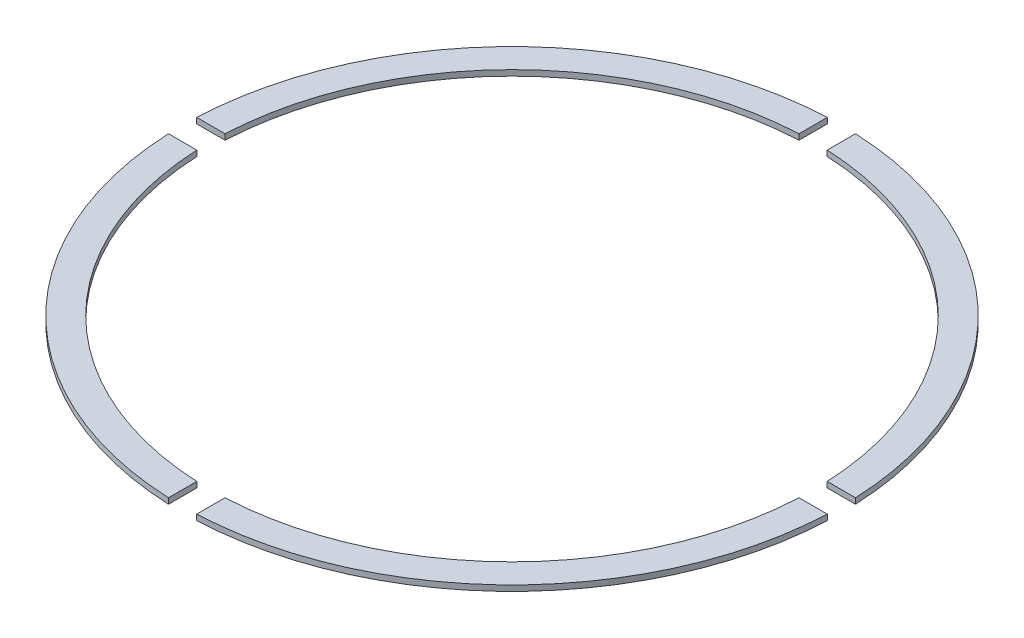
ISO-10303-21;
HEADER;
FILE_DESCRIPTION(('STEP AP214'),'2;1');
FILE_NAME('part.step','',(''),(''),'','','');
FILE_SCHEMA(('AUTOMOTIVE_DESIGN { 1 0 10303 214 1 1 1 1 }'));
ENDSEC;
DATA;
#1=APPLICATION_CONTEXT('core data for automotive mechanical design processes');
#2=APPLICATION_PROTOCOL_DEFINITION('international standard','automotive_design',2000,#1);
#3=PRODUCT_CONTEXT('',#1,'mechanical');
#4=PRODUCT('Part','Part','',(#3));
#5=PRODUCT_RELATED_PRODUCT_CATEGORY('part','',(#4));
#6=PRODUCT_DEFINITION_FORMATION('','',#4);
#7=PRODUCT_DEFINITION_CONTEXT('part definition',#1,'design');
#8=PRODUCT_DEFINITION('design','',#6,#7);
#9=PRODUCT_DEFINITION_SHAPE('','',#8);
#10=(LENGTH_UNIT() NAMED_UNIT(*) SI_UNIT(.MILLI.,.METRE.));
#11=(NAMED_UNIT(*) PLANE_ANGLE_UNIT() SI_UNIT($,.RADIAN.));
#12=(NAMED_UNIT(*) SI_UNIT($,.STERADIAN.) SOLID_ANGLE_UNIT());
#13=UNCERTAINTY_MEASURE_WITH_UNIT(LENGTH_MEASURE(1.E-05),#10,'distance_accuracy_value','');
#14=(GEOMETRIC_REPRESENTATION_CONTEXT(3) GLOBAL_UNCERTAINTY_ASSIGNED_CONTEXT((#13)) GLOBAL_UNIT_ASSIGNED_CONTEXT((#10,
#11,#12)) REPRESENTATION_CONTEXT('',''));
#15=CARTESIAN_POINT('',(0.,0.,0.));
#16=DIRECTION('',(0.,0.,1.));
#17=DIRECTION('',(1.,0.,0.));
#18=AXIS2_PLACEMENT_3D('',#15,#16,#17);
#19=CARTESIAN_POINT('',(0.,1.5,0.));
#20=DIRECTION('',(0.,1.,0.));
#21=DIRECTION('',(0.,0.,1.));
#22=AXIS2_PLACEMENT_3D('',#19,#20,#21);
#23=PLANE('',#22);
#24=DIRECTION('',(0.,0.,-1.));
#25=VECTOR('',#24,1.);
#26=CARTESIAN_POINT('',(7.49999999999936,1.5,183.804563233899));
#27=LINE('',#26,#25);
#28=CARTESIAN_POINT('',(7.49999999999939,1.5,174.839211849059));
#29=VERTEX_POINT('',#28);
#30=CARTESIAN_POINT('',(7.49999999999944,1.5,159.824122084246));
#31=VERTEX_POINT('',#30);
#32=EDGE_CURVE('E52',#29,#31,#27,.T.);
#33=ORIENTED_EDGE('',*,*,#32,.F.);
#34=CARTESIAN_POINT('',(0.,1.5,0.));
#35=DIRECTION('',(0.,1.,0.));
#36=DIRECTION('',(0.,0.,1.));
#37=AXIS2_PLACEMENT_3D('',#34,#35,#36);
#38=CIRCLE('',#37,175.);
#39=CARTESIAN_POINT('',(174.839211849059,1.5,7.5));
#40=VERTEX_POINT('',#39);
#41=EDGE_CURVE('E104',#29,#40,#38,.T.);
#42=ORIENTED_EDGE('',*,*,#41,.T.);
#43=DIRECTION('',(1.,0.,0.));
#44=VECTOR('',#43,1.);
#45=CARTESIAN_POINT('',(183.804563233898,1.5,7.5));
#46=LINE('',#45,#44);
#47=CARTESIAN_POINT('',(159.824122084246,1.5,7.5));
#48=VERTEX_POINT('',#47);
#49=EDGE_CURVE('E85',#48,#40,#46,.T.);
#50=ORIENTED_EDGE('',*,*,#49,.F.);
#51=CARTESIAN_POINT('',(0.,1.5,0.));
#52=DIRECTION('',(0.,1.,0.));
#53=DIRECTION('',(0.,0.,1.));
#54=AXIS2_PLACEMENT_3D('',#51,#52,#53);
#55=CIRCLE('',#54,160.);
#56=EDGE_CURVE('E91',#31,#48,#55,.T.);
#57=ORIENTED_EDGE('',*,*,#56,.F.);
#58=EDGE_LOOP('',(#33,#42,#50,#57));
#59=FACE_BOUND('',#58,.T.);
#60=ADVANCED_FACE('F44',(#59),#23,.T.);
#61=CARTESIAN_POINT('',(0.,-1.5,0.));
#62=DIRECTION('',(0.,1.,0.));
#63=DIRECTION('',(0.,0.,1.));
#64=AXIS2_PLACEMENT_3D('',#61,#62,#63);
#65=PLANE('',#64);
#66=CARTESIAN_POINT('',(0.,-1.5,0.));
#67=DIRECTION('',(0.,1.,0.));
#68=DIRECTION('',(0.,0.,1.));
#69=AXIS2_PLACEMENT_3D('',#66,#67,#68);
#70=CIRCLE('',#69,175.);
#71=CARTESIAN_POINT('',(7.49999999999939,-1.5,174.839211849059));
#72=VERTEX_POINT('',#71);
#73=CARTESIAN_POINT('',(174.839211849059,-1.5,7.5));
#74=VERTEX_POINT('',#73);
#75=EDGE_CURVE('E47',#72,#74,#70,.T.);
#76=ORIENTED_EDGE('',*,*,#75,.F.);
#77=DIRECTION('',(0.,0.,-1.));
#78=VECTOR('',#77,1.);
#79=CARTESIAN_POINT('',(7.49999999999936,-1.5,183.804563233899));
#80=LINE('',#79,#78);
#81=CARTESIAN_POINT('',(7.49999999999944,-1.5,159.824122084246));
#82=VERTEX_POINT('',#81);
#83=EDGE_CURVE('E64',#72,#82,#80,.T.);
#84=ORIENTED_EDGE('',*,*,#83,.T.);
#85=CARTESIAN_POINT('',(0.,-1.5,0.));
#86=DIRECTION('',(0.,1.,0.));
#87=DIRECTION('',(0.,0.,1.));
#88=AXIS2_PLACEMENT_3D('',#85,#86,#87);
#89=CIRCLE('',#88,160.);
#90=CARTESIAN_POINT('',(159.824122084246,-1.5,7.5));
#91=VERTEX_POINT('',#90);
#92=EDGE_CURVE('E93',#82,#91,#89,.T.);
#93=ORIENTED_EDGE('',*,*,#92,.T.);
#94=DIRECTION('',(1.,0.,0.));
#95=VECTOR('',#94,1.);
#96=CARTESIAN_POINT('',(183.804563233898,-1.5,7.5));
#97=LINE('',#96,#95);
#98=EDGE_CURVE('E103',#91,#74,#97,.T.);
#99=ORIENTED_EDGE('',*,*,#98,.T.);
#100=EDGE_LOOP('',(#76,#84,#93,#99));
#101=FACE_BOUND('',#100,.T.);
#102=ADVANCED_FACE('F113',(#101),#65,.F.);
#103=CARTESIAN_POINT('',(0.,1.5,0.));
#104=DIRECTION('',(0.,-1.,0.));
#105=DIRECTION('',(0.,0.,-1.));
#106=AXIS2_PLACEMENT_3D('',#103,#104,#105);
#107=CYLINDRICAL_SURFACE('',#106,175.);
#108=ORIENTED_EDGE('',*,*,#41,.F.);
#109=DIRECTION('',(0.,-1.,0.));
#110=VECTOR('',#109,1.);
#111=CARTESIAN_POINT('',(7.49999999999939,1.5,174.839211849059));
#112=LINE('',#111,#110);
#113=EDGE_CURVE('E60',#29,#72,#112,.T.);
#114=ORIENTED_EDGE('',*,*,#113,.T.);
#115=ORIENTED_EDGE('',*,*,#75,.T.);
#116=DIRECTION('',(0.,-1.,0.));
#117=VECTOR('',#116,1.);
#118=CARTESIAN_POINT('',(174.839211849059,1.5,7.5));
#119=LINE('',#118,#117);
#120=EDGE_CURVE('E97',#74,#40,#119,.F.);
#121=ORIENTED_EDGE('',*,*,#120,.T.);
#122=EDGE_LOOP('',(#108,#114,#115,#121));
#123=FACE_BOUND('',#122,.T.);
#124=ADVANCED_FACE('F118',(#123),#107,.T.);
#125=CARTESIAN_POINT('',(0.,1.5,0.));
#126=DIRECTION('',(0.,-1.,0.));
#127=DIRECTION('',(0.,0.,-1.));
#128=AXIS2_PLACEMENT_3D('',#125,#126,#127);
#129=CYLINDRICAL_SURFACE('',#128,160.);
#130=DIRECTION('',(0.,-1.,0.));
#131=VECTOR('',#130,1.);
#132=CARTESIAN_POINT('',(7.49999999999944,1.5,159.824122084246));
#133=LINE('',#132,#131);
#134=EDGE_CURVE('E13',#31,#82,#133,.T.);
#135=ORIENTED_EDGE('',*,*,#134,.F.);
#136=ORIENTED_EDGE('',*,*,#56,.T.);
#137=DIRECTION('',(0.,-1.,0.));
#138=VECTOR('',#137,1.);
#139=CARTESIAN_POINT('',(159.824122084246,1.5,7.5));
#140=LINE('',#139,#138);
#141=EDGE_CURVE('E96',#91,#48,#140,.F.);
#142=ORIENTED_EDGE('',*,*,#141,.F.);
#143=ORIENTED_EDGE('',*,*,#92,.F.);
#144=EDGE_LOOP('',(#135,#136,#142,#143));
#145=FACE_BOUND('',#144,.T.);
#146=ADVANCED_FACE('F89',(#145),#129,.F.);
#147=CARTESIAN_POINT('',(183.804563233898,-1.5,7.5));
#148=DIRECTION('',(0.,0.,1.));
#149=DIRECTION('',(1.,0.,0.));
#150=AXIS2_PLACEMENT_3D('',#147,#148,#149);
#151=PLANE('',#150);
#152=ORIENTED_EDGE('',*,*,#98,.F.);
#153=ORIENTED_EDGE('',*,*,#141,.T.);
#154=ORIENTED_EDGE('',*,*,#49,.T.);
#155=ORIENTED_EDGE('',*,*,#120,.F.);
#156=EDGE_LOOP('',(#152,#153,#154,#155));
#157=FACE_BOUND('',#156,.T.);
#158=ADVANCED_FACE('F116',(#157),#151,.F.);
#159=CARTESIAN_POINT('',(7.49999999999936,-1.5,183.804563233899));
#160=DIRECTION('',(1.,0.,0.));
#161=DIRECTION('',(0.,0.,-1.));
#162=AXIS2_PLACEMENT_3D('',#159,#160,#161);
#163=PLANE('',#162);
#164=ORIENTED_EDGE('',*,*,#32,.T.);
#165=ORIENTED_EDGE('',*,*,#134,.T.);
#166=ORIENTED_EDGE('',*,*,#83,.F.);
#167=ORIENTED_EDGE('',*,*,#113,.F.);
#168=EDGE_LOOP('',(#164,#165,#166,#167));
#169=FACE_BOUND('',#168,.T.);
#170=ADVANCED_FACE('F81',(#169),#163,.F.);
#171=CLOSED_SHELL('',(#60,#102,#124,#146,#158,#170));
#172=MANIFOLD_SOLID_BREP('B2',#171);
#173=CARTESIAN_POINT('',(183.804563233898,-1.5,-7.5));
#174=DIRECTION('',(0.,0.,-1.));
#175=DIRECTION('',(-1.,0.,0.));
#176=AXIS2_PLACEMENT_3D('',#173,#174,#175);
#177=PLANE('',#176);
#178=DIRECTION('',(-1.,0.,0.));
#179=VECTOR('',#178,1.);
#180=CARTESIAN_POINT('',(183.804563233898,1.5,-7.5));
#181=LINE('',#180,#179);
#182=CARTESIAN_POINT('',(174.839211849059,1.5,-7.5));
#183=VERTEX_POINT('',#182);
#184=CARTESIAN_POINT('',(159.824122084246,1.5,-7.5));
#185=VERTEX_POINT('',#184);
#186=EDGE_CURVE('E241',#183,#185,#181,.T.);
#187=ORIENTED_EDGE('',*,*,#186,.T.);
#188=DIRECTION('',(0.,-1.,0.));
#189=VECTOR('',#188,1.);
#190=CARTESIAN_POINT('',(159.824122084246,1.5,-7.5));
#191=LINE('',#190,#189);
#192=CARTESIAN_POINT('',(159.824122084246,-1.5,-7.5));
#193=VERTEX_POINT('',#192);
#194=EDGE_CURVE('E230',#185,#193,#191,.T.);
#195=ORIENTED_EDGE('',*,*,#194,.T.);
#196=DIRECTION('',(-1.,0.,0.));
#197=VECTOR('',#196,1.);
#198=CARTESIAN_POINT('',(183.804563233898,-1.5,-7.5));
#199=LINE('',#198,#197);
#200=CARTESIAN_POINT('',(174.839211849059,-1.5,-7.5));
#201=VERTEX_POINT('',#200);
#202=EDGE_CURVE('E237',#201,#193,#199,.T.);
#203=ORIENTED_EDGE('',*,*,#202,.F.);
#204=DIRECTION('',(0.,-1.,0.));
#205=VECTOR('',#204,1.);
#206=CARTESIAN_POINT('',(174.839211849059,1.5,-7.5));
#207=LINE('',#206,#205);
#208=EDGE_CURVE('E232',#183,#201,#207,.T.);
#209=ORIENTED_EDGE('',*,*,#208,.F.);
#210=EDGE_LOOP('',(#187,#195,#203,#209));
#211=FACE_BOUND('',#210,.T.);
#212=ADVANCED_FACE('F177',(#211),#177,.F.);
#213=CARTESIAN_POINT('',(0.,1.5,0.));
#214=DIRECTION('',(0.,-1.,0.));
#215=DIRECTION('',(0.,0.,-1.));
#216=AXIS2_PLACEMENT_3D('',#213,#214,#215);
#217=CYLINDRICAL_SURFACE('',#216,175.);
#218=CARTESIAN_POINT('',(0.,-1.5,0.));
#219=DIRECTION('',(0.,1.,0.));
#220=DIRECTION('',(0.,0.,1.));
#221=AXIS2_PLACEMENT_3D('',#218,#219,#220);
#222=CIRCLE('',#221,175.);
#223=CARTESIAN_POINT('',(7.50000000000183,-1.5,-174.839211849059));
#224=VERTEX_POINT('',#223);
#225=EDGE_CURVE('E181',#201,#224,#222,.T.);
#226=ORIENTED_EDGE('',*,*,#225,.T.);
#227=DIRECTION('',(0.,-1.,0.));
#228=VECTOR('',#227,1.);
#229=CARTESIAN_POINT('',(7.50000000000183,1.5,-174.839211849059));
#230=LINE('',#229,#228);
#231=CARTESIAN_POINT('',(7.50000000000183,1.5,-174.839211849059));
#232=VERTEX_POINT('',#231);
#233=EDGE_CURVE('E195',#224,#232,#230,.F.);
#234=ORIENTED_EDGE('',*,*,#233,.T.);
#235=CARTESIAN_POINT('',(0.,1.5,0.));
#236=DIRECTION('',(0.,1.,0.));
#237=DIRECTION('',(0.,0.,1.));
#238=AXIS2_PLACEMENT_3D('',#235,#236,#237);
#239=CIRCLE('',#238,175.);
#240=EDGE_CURVE('E220',#183,#232,#239,.T.);
#241=ORIENTED_EDGE('',*,*,#240,.F.);
#242=ORIENTED_EDGE('',*,*,#208,.T.);
#243=EDGE_LOOP('',(#226,#234,#241,#242));
#244=FACE_BOUND('',#243,.T.);
#245=ADVANCED_FACE('F249',(#244),#217,.T.);
#246=CARTESIAN_POINT('',(0.,1.5,0.));
#247=DIRECTION('',(0.,-1.,0.));
#248=DIRECTION('',(0.,0.,-1.));
#249=AXIS2_PLACEMENT_3D('',#246,#247,#248);
#250=CYLINDRICAL_SURFACE('',#249,160.);
#251=DIRECTION('',(0.,-1.,0.));
#252=VECTOR('',#251,1.);
#253=CARTESIAN_POINT('',(7.50000000000168,1.5,-159.824122084246));
#254=LINE('',#253,#252);
#255=CARTESIAN_POINT('',(7.50000000000168,-1.5,-159.824122084246));
#256=VERTEX_POINT('',#255);
#257=CARTESIAN_POINT('',(7.50000000000168,1.5,-159.824122084246));
#258=VERTEX_POINT('',#257);
#259=EDGE_CURVE('E187',#256,#258,#254,.F.);
#260=ORIENTED_EDGE('',*,*,#259,.F.);
#261=CARTESIAN_POINT('',(0.,-1.5,0.));
#262=DIRECTION('',(0.,1.,0.));
#263=DIRECTION('',(0.,0.,1.));
#264=AXIS2_PLACEMENT_3D('',#261,#262,#263);
#265=CIRCLE('',#264,160.);
#266=EDGE_CURVE('E231',#193,#256,#265,.T.);
#267=ORIENTED_EDGE('',*,*,#266,.F.);
#268=ORIENTED_EDGE('',*,*,#194,.F.);
#269=CARTESIAN_POINT('',(0.,1.5,0.));
#270=DIRECTION('',(0.,1.,0.));
#271=DIRECTION('',(0.,0.,1.));
#272=AXIS2_PLACEMENT_3D('',#269,#270,#271);
#273=CIRCLE('',#272,160.);
#274=EDGE_CURVE('E226',#185,#258,#273,.T.);
#275=ORIENTED_EDGE('',*,*,#274,.T.);
#276=EDGE_LOOP('',(#260,#267,#268,#275));
#277=FACE_BOUND('',#276,.T.);
#278=ADVANCED_FACE('F229',(#277),#250,.F.);
#279=CARTESIAN_POINT('',(0.,-1.5,0.));
#280=DIRECTION('',(0.,1.,0.));
#281=DIRECTION('',(0.,0.,1.));
#282=AXIS2_PLACEMENT_3D('',#279,#280,#281);
#283=PLANE('',#282);
#284=ORIENTED_EDGE('',*,*,#266,.T.);
#285=DIRECTION('',(0.,0.,-1.));
#286=VECTOR('',#285,1.);
#287=CARTESIAN_POINT('',(7.50000000000192,-1.5,-183.804563233898));
#288=LINE('',#287,#286);
#289=EDGE_CURVE('E212',#256,#224,#288,.T.);
#290=ORIENTED_EDGE('',*,*,#289,.T.);
#291=ORIENTED_EDGE('',*,*,#225,.F.);
#292=ORIENTED_EDGE('',*,*,#202,.T.);
#293=EDGE_LOOP('',(#284,#290,#291,#292));
#294=FACE_BOUND('',#293,.T.);
#295=ADVANCED_FACE('F251',(#294),#283,.F.);
#296=CARTESIAN_POINT('',(0.,1.5,0.));
#297=DIRECTION('',(0.,1.,0.));
#298=DIRECTION('',(0.,0.,1.));
#299=AXIS2_PLACEMENT_3D('',#296,#297,#298);
#300=PLANE('',#299);
#301=DIRECTION('',(0.,0.,-1.));
#302=VECTOR('',#301,1.);
#303=CARTESIAN_POINT('',(7.50000000000192,1.5,-183.804563233898));
#304=LINE('',#303,#302);
#305=EDGE_CURVE('E42',#258,#232,#304,.T.);
#306=ORIENTED_EDGE('',*,*,#305,.F.);
#307=ORIENTED_EDGE('',*,*,#274,.F.);
#308=ORIENTED_EDGE('',*,*,#186,.F.);
#309=ORIENTED_EDGE('',*,*,#240,.T.);
#310=EDGE_LOOP('',(#306,#307,#308,#309));
#311=FACE_BOUND('',#310,.T.);
#312=ADVANCED_FACE('F179',(#311),#300,.T.);
#313=CARTESIAN_POINT('',(7.50000000000192,-1.5,-183.804563233898));
#314=DIRECTION('',(1.,0.,0.));
#315=DIRECTION('',(0.,0.,-1.));
#316=AXIS2_PLACEMENT_3D('',#313,#314,#315);
#317=PLANE('',#316);
#318=ORIENTED_EDGE('',*,*,#289,.F.);
#319=ORIENTED_EDGE('',*,*,#259,.T.);
#320=ORIENTED_EDGE('',*,*,#305,.T.);
#321=ORIENTED_EDGE('',*,*,#233,.F.);
#322=EDGE_LOOP('',(#318,#319,#320,#321));
#323=FACE_BOUND('',#322,.T.);
#324=ADVANCED_FACE('F215',(#323),#317,.F.);
#325=CLOSED_SHELL('',(#212,#245,#278,#295,#312,#324));
#326=MANIFOLD_SOLID_BREP('B7',#325);
#327=CARTESIAN_POINT('',(0.,1.5,0.));
#328=DIRECTION('',(0.,-1.,0.));
#329=DIRECTION('',(0.,0.,-1.));
#330=AXIS2_PLACEMENT_3D('',#327,#328,#329);
#331=CYLINDRICAL_SURFACE('',#330,175.);
#332=CARTESIAN_POINT('',(0.,-1.5,0.));
#333=DIRECTION('',(0.,1.,0.));
#334=DIRECTION('',(0.,0.,1.));
#335=AXIS2_PLACEMENT_3D('',#332,#333,#334);
#336=CIRCLE('',#335,175.);
#337=CARTESIAN_POINT('',(-7.49999999999817,-1.5,-174.839211849059));
#338=VERTEX_POINT('',#337);
#339=CARTESIAN_POINT('',(-174.839211849059,-1.5,-7.5));
#340=VERTEX_POINT('',#339);
#341=EDGE_CURVE('E313',#338,#340,#336,.T.);
#342=ORIENTED_EDGE('',*,*,#341,.T.);
#343=DIRECTION('',(0.,-1.,0.));
#344=VECTOR('',#343,1.);
#345=CARTESIAN_POINT('',(-174.839211849059,1.5,-7.5));
#346=LINE('',#345,#344);
#347=CARTESIAN_POINT('',(-174.839211849059,1.5,-7.5));
#348=VERTEX_POINT('',#347);
#349=EDGE_CURVE('E327',#340,#348,#346,.F.);
#350=ORIENTED_EDGE('',*,*,#349,.T.);
#351=CARTESIAN_POINT('',(0.,1.5,0.));
#352=DIRECTION('',(0.,1.,0.));
#353=DIRECTION('',(0.,0.,1.));
#354=AXIS2_PLACEMENT_3D('',#351,#352,#353);
#355=CIRCLE('',#354,175.);
#356=CARTESIAN_POINT('',(-7.49999999999817,1.5,-174.839211849059));
#357=VERTEX_POINT('',#356);
#358=EDGE_CURVE('E372',#357,#348,#355,.T.);
#359=ORIENTED_EDGE('',*,*,#358,.F.);
#360=DIRECTION('',(0.,-1.,0.));
#361=VECTOR('',#360,1.);
#362=CARTESIAN_POINT('',(-7.49999999999817,1.5,-174.839211849059));
#363=LINE('',#362,#361);
#364=EDGE_CURVE('E348',#357,#338,#363,.T.);
#365=ORIENTED_EDGE('',*,*,#364,.T.);
#366=EDGE_LOOP('',(#342,#350,#359,#365));
#367=FACE_BOUND('',#366,.T.);
#368=ADVANCED_FACE('F309',(#367),#331,.T.);
#369=CARTESIAN_POINT('',(0.,1.5,0.));
#370=DIRECTION('',(0.,-1.,0.));
#371=DIRECTION('',(0.,0.,-1.));
#372=AXIS2_PLACEMENT_3D('',#369,#370,#371);
#373=CYLINDRICAL_SURFACE('',#372,160.);
#374=DIRECTION('',(0.,-1.,0.));
#375=VECTOR('',#374,1.);
#376=CARTESIAN_POINT('',(-159.824122084246,1.5,-7.5));
#377=LINE('',#376,#375);
#378=CARTESIAN_POINT('',(-159.824122084246,-1.5,-7.5));
#379=VERTEX_POINT('',#378);
#380=CARTESIAN_POINT('',(-159.824122084246,1.5,-7.5));
#381=VERTEX_POINT('',#380);
#382=EDGE_CURVE('E319',#379,#381,#377,.F.);
#383=ORIENTED_EDGE('',*,*,#382,.F.);
#384=CARTESIAN_POINT('',(0.,-1.5,0.));
#385=DIRECTION('',(0.,1.,0.));
#386=DIRECTION('',(0.,0.,1.));
#387=AXIS2_PLACEMENT_3D('',#384,#385,#386);
#388=CIRCLE('',#387,160.);
#389=CARTESIAN_POINT('',(-7.49999999999832,-1.5,-159.824122084246));
#390=VERTEX_POINT('',#389);
#391=EDGE_CURVE('E358',#390,#379,#388,.T.);
#392=ORIENTED_EDGE('',*,*,#391,.F.);
#393=DIRECTION('',(0.,-1.,0.));
#394=VECTOR('',#393,1.);
#395=CARTESIAN_POINT('',(-7.49999999999832,1.5,-159.824122084246));
#396=LINE('',#395,#394);
#397=CARTESIAN_POINT('',(-7.49999999999832,1.5,-159.824122084246));
#398=VERTEX_POINT('',#397);
#399=EDGE_CURVE('E367',#398,#390,#396,.T.);
#400=ORIENTED_EDGE('',*,*,#399,.F.);
#401=CARTESIAN_POINT('',(0.,1.5,0.));
#402=DIRECTION('',(0.,1.,0.));
#403=DIRECTION('',(0.,0.,1.));
#404=AXIS2_PLACEMENT_3D('',#401,#402,#403);
#405=CIRCLE('',#404,160.);
#406=EDGE_CURVE('E366',#398,#381,#405,.T.);
#407=ORIENTED_EDGE('',*,*,#406,.T.);
#408=EDGE_LOOP('',(#383,#392,#400,#407));
#409=FACE_BOUND('',#408,.T.);
#410=ADVANCED_FACE('F363',(#409),#373,.F.);
#411=CARTESIAN_POINT('',(0.,-1.5,0.));
#412=DIRECTION('',(0.,1.,0.));
#413=DIRECTION('',(0.,0.,1.));
#414=AXIS2_PLACEMENT_3D('',#411,#412,#413);
#415=PLANE('',#414);
#416=ORIENTED_EDGE('',*,*,#391,.T.);
#417=DIRECTION('',(-1.,0.,0.));
#418=VECTOR('',#417,1.);
#419=CARTESIAN_POINT('',(-183.804563233898,-1.5,-7.5));
#420=LINE('',#419,#418);
#421=EDGE_CURVE('E350',#379,#340,#420,.T.);
#422=ORIENTED_EDGE('',*,*,#421,.T.);
#423=ORIENTED_EDGE('',*,*,#341,.F.);
#424=DIRECTION('',(0.,0.,1.));
#425=VECTOR('',#424,1.);
#426=CARTESIAN_POINT('',(-7.49999999999808,-1.5,-183.804563233899));
#427=LINE('',#426,#425);
#428=EDGE_CURVE('E345',#338,#390,#427,.T.);
#429=ORIENTED_EDGE('',*,*,#428,.T.);
#430=EDGE_LOOP('',(#416,#422,#423,#429));
#431=FACE_BOUND('',#430,.T.);
#432=ADVANCED_FACE('F369',(#431),#415,.F.);
#433=CARTESIAN_POINT('',(0.,1.5,0.));
#434=DIRECTION('',(0.,1.,0.));
#435=DIRECTION('',(0.,0.,1.));
#436=AXIS2_PLACEMENT_3D('',#433,#434,#435);
#437=PLANE('',#436);
#438=DIRECTION('',(-1.,0.,0.));
#439=VECTOR('',#438,1.);
#440=CARTESIAN_POINT('',(-183.804563233898,1.5,-7.5));
#441=LINE('',#440,#439);
#442=EDGE_CURVE('E175',#381,#348,#441,.T.);
#443=ORIENTED_EDGE('',*,*,#442,.F.);
#444=ORIENTED_EDGE('',*,*,#406,.F.);
#445=DIRECTION('',(0.,0.,1.));
#446=VECTOR('',#445,1.);
#447=CARTESIAN_POINT('',(-7.49999999999808,1.5,-183.804563233899));
#448=LINE('',#447,#446);
#449=EDGE_CURVE('E374',#357,#398,#448,.T.);
#450=ORIENTED_EDGE('',*,*,#449,.F.);
#451=ORIENTED_EDGE('',*,*,#358,.T.);
#452=EDGE_LOOP('',(#443,#444,#450,#451));
#453=FACE_BOUND('',#452,.T.);
#454=ADVANCED_FACE('F311',(#453),#437,.T.);
#455=CARTESIAN_POINT('',(-7.49999999999808,-1.5,-183.804563233899));
#456=DIRECTION('',(-1.,0.,0.));
#457=DIRECTION('',(0.,0.,1.));
#458=AXIS2_PLACEMENT_3D('',#455,#456,#457);
#459=PLANE('',#458);
#460=ORIENTED_EDGE('',*,*,#449,.T.);
#461=ORIENTED_EDGE('',*,*,#399,.T.);
#462=ORIENTED_EDGE('',*,*,#428,.F.);
#463=ORIENTED_EDGE('',*,*,#364,.F.);
#464=EDGE_LOOP('',(#460,#461,#462,#463));
#465=FACE_BOUND('',#464,.T.);
#466=ADVANCED_FACE('F380',(#465),#459,.F.);
#467=CARTESIAN_POINT('',(-183.804563233898,-1.5,-7.5));
#468=DIRECTION('',(0.,0.,-1.));
#469=DIRECTION('',(-1.,0.,0.));
#470=AXIS2_PLACEMENT_3D('',#467,#468,#469);
#471=PLANE('',#470);
#472=ORIENTED_EDGE('',*,*,#421,.F.);
#473=ORIENTED_EDGE('',*,*,#382,.T.);
#474=ORIENTED_EDGE('',*,*,#442,.T.);
#475=ORIENTED_EDGE('',*,*,#349,.F.);
#476=EDGE_LOOP('',(#472,#473,#474,#475));
#477=FACE_BOUND('',#476,.T.);
#478=ADVANCED_FACE('F352',(#477),#471,.F.);
#479=CLOSED_SHELL('',(#368,#410,#432,#454,#466,#478));
#480=MANIFOLD_SOLID_BREP('B36',#479);
#481=CARTESIAN_POINT('',(0.,1.5,0.));
#482=DIRECTION('',(0.,-1.,0.));
#483=DIRECTION('',(0.,0.,-1.));
#484=AXIS2_PLACEMENT_3D('',#481,#482,#483);
#485=CYLINDRICAL_SURFACE('',#484,175.);
#486=CARTESIAN_POINT('',(0.,-1.5,0.));
#487=DIRECTION('',(0.,1.,0.));
#488=DIRECTION('',(0.,0.,1.));
#489=AXIS2_PLACEMENT_3D('',#486,#487,#488);
#490=CIRCLE('',#489,175.);
#491=CARTESIAN_POINT('',(-174.839211849059,-1.5,7.5));
#492=VERTEX_POINT('',#491);
#493=CARTESIAN_POINT('',(-7.50000000000061,-1.5,174.839211849059));
#494=VERTEX_POINT('',#493);
#495=EDGE_CURVE('E490',#492,#494,#490,.T.);
#496=ORIENTED_EDGE('',*,*,#495,.T.);
#497=DIRECTION('',(0.,-1.,0.));
#498=VECTOR('',#497,1.);
#499=CARTESIAN_POINT('',(-7.50000000000061,1.5,174.839211849059));
#500=LINE('',#499,#498);
#501=CARTESIAN_POINT('',(-7.50000000000061,1.5,174.839211849059));
#502=VERTEX_POINT('',#501);
#503=EDGE_CURVE('E478',#494,#502,#500,.F.);
#504=ORIENTED_EDGE('',*,*,#503,.T.);
#505=CARTESIAN_POINT('',(0.,1.5,0.));
#506=DIRECTION('',(0.,1.,0.));
#507=DIRECTION('',(0.,0.,1.));
#508=AXIS2_PLACEMENT_3D('',#505,#506,#507);
#509=CIRCLE('',#508,175.);
#510=CARTESIAN_POINT('',(-174.839211849059,1.5,7.5));
#511=VERTEX_POINT('',#510);
#512=EDGE_CURVE('E485',#511,#502,#509,.T.);
#513=ORIENTED_EDGE('',*,*,#512,.F.);
#514=DIRECTION('',(0.,-1.,0.));
#515=VECTOR('',#514,1.);
#516=CARTESIAN_POINT('',(-174.839211849059,1.5,7.5));
#517=LINE('',#516,#515);
#518=EDGE_CURVE('E470',#511,#492,#517,.T.);
#519=ORIENTED_EDGE('',*,*,#518,.T.);
#520=EDGE_LOOP('',(#496,#504,#513,#519));
#521=FACE_BOUND('',#520,.T.);
#522=ADVANCED_FACE('F433',(#521),#485,.T.);
#523=CARTESIAN_POINT('',(0.,1.5,0.));
#524=DIRECTION('',(0.,-1.,0.));
#525=DIRECTION('',(0.,0.,-1.));
#526=AXIS2_PLACEMENT_3D('',#523,#524,#525);
#527=CYLINDRICAL_SURFACE('',#526,160.);
#528=DIRECTION('',(0.,-1.,0.));
#529=VECTOR('',#528,1.);
#530=CARTESIAN_POINT('',(-7.50000000000056,1.5,159.824122084246));
#531=LINE('',#530,#529);
#532=CARTESIAN_POINT('',(-7.50000000000056,-1.5,159.824122084246));
#533=VERTEX_POINT('',#532);
#534=CARTESIAN_POINT('',(-7.50000000000056,1.5,159.824122084246));
#535=VERTEX_POINT('',#534);
#536=EDGE_CURVE('E307',#533,#535,#531,.F.);
#537=ORIENTED_EDGE('',*,*,#536,.F.);
#538=CARTESIAN_POINT('',(0.,-1.5,0.));
#539=DIRECTION('',(0.,1.,0.));
#540=DIRECTION('',(0.,0.,1.));
#541=AXIS2_PLACEMENT_3D('',#538,#539,#540);
#542=CIRCLE('',#541,160.);
#543=CARTESIAN_POINT('',(-159.824122084246,-1.5,7.5));
#544=VERTEX_POINT('',#543);
#545=EDGE_CURVE('E494',#544,#533,#542,.T.);
#546=ORIENTED_EDGE('',*,*,#545,.F.);
#547=DIRECTION('',(0.,-1.,0.));
#548=VECTOR('',#547,1.);
#549=CARTESIAN_POINT('',(-159.824122084246,1.5,7.5));
#550=LINE('',#549,#548);
#551=CARTESIAN_POINT('',(-159.824122084246,1.5,7.5));
#552=VERTEX_POINT('',#551);
#553=EDGE_CURVE('E440',#552,#544,#550,.T.);
#554=ORIENTED_EDGE('',*,*,#553,.F.);
#555=CARTESIAN_POINT('',(0.,1.5,0.));
#556=DIRECTION('',(0.,1.,0.));
#557=DIRECTION('',(0.,0.,1.));
#558=AXIS2_PLACEMENT_3D('',#555,#556,#557);
#559=CIRCLE('',#558,160.);
#560=EDGE_CURVE('E487',#552,#535,#559,.T.);
#561=ORIENTED_EDGE('',*,*,#560,.T.);
#562=EDGE_LOOP('',(#537,#546,#554,#561));
#563=FACE_BOUND('',#562,.T.);
#564=ADVANCED_FACE('F504',(#563),#527,.F.);
#565=CARTESIAN_POINT('',(0.,-1.5,0.));
#566=DIRECTION('',(0.,1.,0.));
#567=DIRECTION('',(0.,0.,1.));
#568=AXIS2_PLACEMENT_3D('',#565,#566,#567);
#569=PLANE('',#568);
#570=ORIENTED_EDGE('',*,*,#545,.T.);
#571=DIRECTION('',(0.,0.,1.));
#572=VECTOR('',#571,1.);
#573=CARTESIAN_POINT('',(-7.50000000000064,-1.5,183.804563233898));
#574=LINE('',#573,#572);
#575=EDGE_CURVE('E446',#533,#494,#574,.T.);
#576=ORIENTED_EDGE('',*,*,#575,.T.);
#577=ORIENTED_EDGE('',*,*,#495,.F.);
#578=DIRECTION('',(1.,0.,0.));
#579=VECTOR('',#578,1.);
#580=CARTESIAN_POINT('',(-183.804563233898,-1.5,7.5));
#581=LINE('',#580,#579);
#582=EDGE_CURVE('E473',#492,#544,#581,.T.);
#583=ORIENTED_EDGE('',*,*,#582,.T.);
#584=EDGE_LOOP('',(#570,#576,#577,#583));
#585=FACE_BOUND('',#584,.T.);
#586=ADVANCED_FACE('F507',(#585),#569,.F.);
#587=CARTESIAN_POINT('',(0.,1.5,0.));
#588=DIRECTION('',(0.,1.,0.));
#589=DIRECTION('',(0.,0.,1.));
#590=AXIS2_PLACEMENT_3D('',#587,#588,#589);
#591=PLANE('',#590);
#592=DIRECTION('',(0.,0.,1.));
#593=VECTOR('',#592,1.);
#594=CARTESIAN_POINT('',(-7.50000000000064,1.5,183.804563233898));
#595=LINE('',#594,#593);
#596=EDGE_CURVE('E499',#535,#502,#595,.T.);
#597=ORIENTED_EDGE('',*,*,#596,.F.);
#598=ORIENTED_EDGE('',*,*,#560,.F.);
#599=DIRECTION('',(1.,0.,0.));
#600=VECTOR('',#599,1.);
#601=CARTESIAN_POINT('',(-183.804563233898,1.5,7.5));
#602=LINE('',#601,#600);
#603=EDGE_CURVE('E454',#511,#552,#602,.T.);
#604=ORIENTED_EDGE('',*,*,#603,.F.);
#605=ORIENTED_EDGE('',*,*,#512,.T.);
#606=EDGE_LOOP('',(#597,#598,#604,#605));
#607=FACE_BOUND('',#606,.T.);
#608=ADVANCED_FACE('F484',(#607),#591,.T.);
#609=CARTESIAN_POINT('',(-183.804563233898,-1.5,7.5));
#610=DIRECTION('',(0.,0.,1.));
#611=DIRECTION('',(1.,0.,0.));
#612=AXIS2_PLACEMENT_3D('',#609,#610,#611);
#613=PLANE('',#612);
#614=ORIENTED_EDGE('',*,*,#603,.T.);
#615=ORIENTED_EDGE('',*,*,#553,.T.);
#616=ORIENTED_EDGE('',*,*,#582,.F.);
#617=ORIENTED_EDGE('',*,*,#518,.F.);
#618=EDGE_LOOP('',(#614,#615,#616,#617));
#619=FACE_BOUND('',#618,.T.);
#620=ADVANCED_FACE('F471',(#619),#613,.F.);
#621=CARTESIAN_POINT('',(-7.50000000000064,-1.5,183.804563233898));
#622=DIRECTION('',(-1.,0.,0.));
#623=DIRECTION('',(0.,0.,1.));
#624=AXIS2_PLACEMENT_3D('',#621,#622,#623);
#625=PLANE('',#624);
#626=ORIENTED_EDGE('',*,*,#575,.F.);
#627=ORIENTED_EDGE('',*,*,#536,.T.);
#628=ORIENTED_EDGE('',*,*,#596,.T.);
#629=ORIENTED_EDGE('',*,*,#503,.F.);
#630=EDGE_LOOP('',(#626,#627,#628,#629));
#631=FACE_BOUND('',#630,.T.);
#632=ADVANCED_FACE('F502',(#631),#625,.F.);
#633=CLOSED_SHELL('',(#522,#564,#586,#608,#620,#632));
#634=MANIFOLD_SOLID_BREP('B169',#633);
#635=ADVANCED_BREP_SHAPE_REPRESENTATION('',(#18,#172,#326,#480,#634),#14);
#636=SHAPE_DEFINITION_REPRESENTATION(#9,#635);
ENDSEC;
END-ISO-10303-21;
